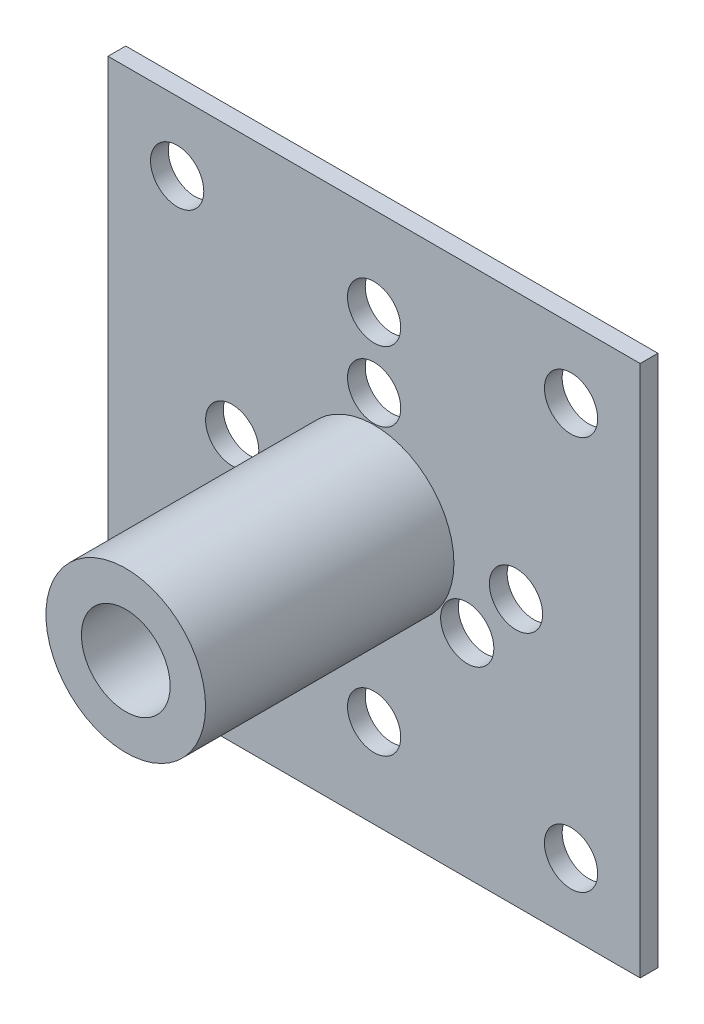
ISO-10303-21;
HEADER;
FILE_DESCRIPTION(('STEP AP214'),'2;1');
FILE_NAME('part.step','',(''),(''),'','','');
FILE_SCHEMA(('AUTOMOTIVE_DESIGN { 1 0 10303 214 1 1 1 1 }'));
ENDSEC;
DATA;
#1=APPLICATION_CONTEXT('core data for automotive mechanical design processes');
#2=APPLICATION_PROTOCOL_DEFINITION('international standard','automotive_design',2000,#1);
#3=PRODUCT_CONTEXT('',#1,'mechanical');
#4=PRODUCT('Part','Part','',(#3));
#5=PRODUCT_RELATED_PRODUCT_CATEGORY('part','',(#4));
#6=PRODUCT_DEFINITION_FORMATION('','',#4);
#7=PRODUCT_DEFINITION_CONTEXT('part definition',#1,'design');
#8=PRODUCT_DEFINITION('design','',#6,#7);
#9=PRODUCT_DEFINITION_SHAPE('','',#8);
#10=(LENGTH_UNIT() NAMED_UNIT(*) SI_UNIT(.MILLI.,.METRE.));
#11=(NAMED_UNIT(*) PLANE_ANGLE_UNIT() SI_UNIT($,.RADIAN.));
#12=(NAMED_UNIT(*) SI_UNIT($,.STERADIAN.) SOLID_ANGLE_UNIT());
#13=UNCERTAINTY_MEASURE_WITH_UNIT(LENGTH_MEASURE(1.E-05),#10,'distance_accuracy_value','');
#14=(GEOMETRIC_REPRESENTATION_CONTEXT(3) GLOBAL_UNCERTAINTY_ASSIGNED_CONTEXT((#13)) GLOBAL_UNIT_ASSIGNED_CONTEXT((#10,
#11,#12)) REPRESENTATION_CONTEXT('',''));
#15=CARTESIAN_POINT('',(0.,0.,0.));
#16=DIRECTION('',(0.,0.,1.));
#17=DIRECTION('',(1.,0.,0.));
#18=AXIS2_PLACEMENT_3D('',#15,#16,#17);
#19=CARTESIAN_POINT('',(0.,0.,15.));
#20=DIRECTION('',(0.,0.,1.));
#21=DIRECTION('',(1.,0.,0.));
#22=AXIS2_PLACEMENT_3D('',#19,#20,#21);
#23=PLANE('',#22);
#24=CARTESIAN_POINT('',(0.,0.,15.));
#25=DIRECTION('',(0.,0.,1.));
#26=DIRECTION('',(1.,0.,0.));
#27=AXIS2_PLACEMENT_3D('',#24,#25,#26);
#28=CIRCLE('',#27,4.5);
#29=CARTESIAN_POINT('',(4.5,0.,15.));
#30=VERTEX_POINT('',#29);
#31=EDGE_CURVE('E11',#30,#30,#28,.T.);
#32=ORIENTED_EDGE('',*,*,#31,.T.);
#33=EDGE_LOOP('',(#32));
#34=FACE_BOUND('',#33,.T.);
#35=CARTESIAN_POINT('',(0.,0.,15.));
#36=DIRECTION('',(0.,0.,1.));
#37=DIRECTION('',(1.,0.,0.));
#38=AXIS2_PLACEMENT_3D('',#35,#36,#37);
#39=CIRCLE('',#38,2.5);
#40=CARTESIAN_POINT('',(2.5,0.,15.));
#41=VERTEX_POINT('',#40);
#42=EDGE_CURVE('E49',#41,#41,#39,.T.);
#43=ORIENTED_EDGE('',*,*,#42,.F.);
#44=EDGE_LOOP('',(#43));
#45=FACE_BOUND('',#44,.T.);
#46=ADVANCED_FACE('F39',(#34,#45),#23,.T.);
#47=CARTESIAN_POINT('',(0.,0.,15.));
#48=DIRECTION('',(0.,0.,-1.));
#49=DIRECTION('',(-1.,0.,0.));
#50=AXIS2_PLACEMENT_3D('',#47,#48,#49);
#51=CYLINDRICAL_SURFACE('',#50,4.5);
#52=CARTESIAN_POINT('',(0.,0.,1.));
#53=DIRECTION('',(0.,0.,1.));
#54=DIRECTION('',(1.,0.,0.));
#55=AXIS2_PLACEMENT_3D('',#52,#53,#54);
#56=CIRCLE('',#55,4.5);
#57=CARTESIAN_POINT('',(4.5,0.,1.));
#58=VERTEX_POINT('',#57);
#59=EDGE_CURVE('E129',#58,#58,#56,.T.);
#60=ORIENTED_EDGE('',*,*,#59,.T.);
#61=EDGE_LOOP('',(#60));
#62=FACE_BOUND('',#61,.T.);
#63=ORIENTED_EDGE('',*,*,#31,.F.);
#64=EDGE_LOOP('',(#63));
#65=FACE_BOUND('',#64,.T.);
#66=ADVANCED_FACE('F41',(#62,#65),#51,.T.);
#67=CARTESIAN_POINT('',(0.,0.,15.));
#68=DIRECTION('',(0.,0.,-1.));
#69=DIRECTION('',(-1.,0.,0.));
#70=AXIS2_PLACEMENT_3D('',#67,#68,#69);
#71=CYLINDRICAL_SURFACE('',#70,2.5);
#72=ORIENTED_EDGE('',*,*,#42,.T.);
#73=EDGE_LOOP('',(#72));
#74=FACE_BOUND('',#73,.T.);
#75=CARTESIAN_POINT('',(0.,0.,0.));
#76=DIRECTION('',(0.,0.,1.));
#77=DIRECTION('',(1.,0.,0.));
#78=AXIS2_PLACEMENT_3D('',#75,#76,#77);
#79=CIRCLE('',#78,2.5);
#80=CARTESIAN_POINT('',(2.5,0.,0.));
#81=VERTEX_POINT('',#80);
#82=EDGE_CURVE('E197',#81,#81,#79,.T.);
#83=ORIENTED_EDGE('',*,*,#82,.F.);
#84=EDGE_LOOP('',(#83));
#85=FACE_BOUND('',#84,.T.);
#86=ADVANCED_FACE('F136',(#74,#85),#71,.F.);
#87=CARTESIAN_POINT('',(-15.,-15.,1.));
#88=DIRECTION('',(1.,0.,0.));
#89=DIRECTION('',(0.,0.,-1.));
#90=AXIS2_PLACEMENT_3D('',#87,#88,#89);
#91=PLANE('',#90);
#92=DIRECTION('',(0.,-1.,0.));
#93=VECTOR('',#92,1.);
#94=CARTESIAN_POINT('',(-15.,-15.,0.));
#95=LINE('',#94,#93);
#96=CARTESIAN_POINT('',(-15.,15.,0.));
#97=VERTEX_POINT('',#96);
#98=CARTESIAN_POINT('',(-15.,-15.,0.));
#99=VERTEX_POINT('',#98);
#100=EDGE_CURVE('E112',#97,#99,#95,.T.);
#101=ORIENTED_EDGE('',*,*,#100,.T.);
#102=DIRECTION('',(0.,0.,-1.));
#103=VECTOR('',#102,1.);
#104=CARTESIAN_POINT('',(-15.,-15.,1.));
#105=LINE('',#104,#103);
#106=CARTESIAN_POINT('',(-15.,-15.,1.));
#107=VERTEX_POINT('',#106);
#108=EDGE_CURVE('E101',#107,#99,#105,.T.);
#109=ORIENTED_EDGE('',*,*,#108,.F.);
#110=DIRECTION('',(0.,-1.,0.));
#111=VECTOR('',#110,1.);
#112=CARTESIAN_POINT('',(-15.,-15.,1.));
#113=LINE('',#112,#111);
#114=CARTESIAN_POINT('',(-15.,15.,1.));
#115=VERTEX_POINT('',#114);
#116=EDGE_CURVE('E93',#115,#107,#113,.T.);
#117=ORIENTED_EDGE('',*,*,#116,.F.);
#118=DIRECTION('',(0.,0.,-1.));
#119=VECTOR('',#118,1.);
#120=CARTESIAN_POINT('',(-15.,15.,1.));
#121=LINE('',#120,#119);
#122=EDGE_CURVE('E108',#115,#97,#121,.T.);
#123=ORIENTED_EDGE('',*,*,#122,.T.);
#124=EDGE_LOOP('',(#101,#109,#117,#123));
#125=FACE_BOUND('',#124,.T.);
#126=ADVANCED_FACE('F212',(#125),#91,.F.);
#127=CARTESIAN_POINT('',(15.,-15.,1.));
#128=DIRECTION('',(0.,1.,0.));
#129=DIRECTION('',(-1.,0.,0.));
#130=AXIS2_PLACEMENT_3D('',#127,#128,#129);
#131=PLANE('',#130);
#132=DIRECTION('',(1.,0.,0.));
#133=VECTOR('',#132,1.);
#134=CARTESIAN_POINT('',(15.,-15.,0.));
#135=LINE('',#134,#133);
#136=CARTESIAN_POINT('',(15.,-15.,0.));
#137=VERTEX_POINT('',#136);
#138=EDGE_CURVE('E99',#99,#137,#135,.T.);
#139=ORIENTED_EDGE('',*,*,#138,.T.);
#140=DIRECTION('',(0.,0.,-1.));
#141=VECTOR('',#140,1.);
#142=CARTESIAN_POINT('',(15.,-15.,1.));
#143=LINE('',#142,#141);
#144=CARTESIAN_POINT('',(15.,-15.,1.));
#145=VERTEX_POINT('',#144);
#146=EDGE_CURVE('E97',#145,#137,#143,.T.);
#147=ORIENTED_EDGE('',*,*,#146,.F.);
#148=DIRECTION('',(1.,0.,0.));
#149=VECTOR('',#148,1.);
#150=CARTESIAN_POINT('',(15.,-15.,1.));
#151=LINE('',#150,#149);
#152=EDGE_CURVE('E88',#107,#145,#151,.T.);
#153=ORIENTED_EDGE('',*,*,#152,.F.);
#154=ORIENTED_EDGE('',*,*,#108,.T.);
#155=EDGE_LOOP('',(#139,#147,#153,#154));
#156=FACE_BOUND('',#155,.T.);
#157=ADVANCED_FACE('F98',(#156),#131,.F.);
#158=CARTESIAN_POINT('',(15.,-15.,1.));
#159=DIRECTION('',(-1.,0.,0.));
#160=DIRECTION('',(0.,0.,1.));
#161=AXIS2_PLACEMENT_3D('',#158,#159,#160);
#162=PLANE('',#161);
#163=DIRECTION('',(0.,1.,0.));
#164=VECTOR('',#163,1.);
#165=CARTESIAN_POINT('',(15.,-15.,0.));
#166=LINE('',#165,#164);
#167=CARTESIAN_POINT('',(15.,15.,0.));
#168=VERTEX_POINT('',#167);
#169=EDGE_CURVE('E74',#137,#168,#166,.T.);
#170=ORIENTED_EDGE('',*,*,#169,.T.);
#171=DIRECTION('',(0.,0.,-1.));
#172=VECTOR('',#171,1.);
#173=CARTESIAN_POINT('',(15.,15.,1.));
#174=LINE('',#173,#172);
#175=CARTESIAN_POINT('',(15.,15.,1.));
#176=VERTEX_POINT('',#175);
#177=EDGE_CURVE('E102',#176,#168,#174,.T.);
#178=ORIENTED_EDGE('',*,*,#177,.F.);
#179=DIRECTION('',(0.,1.,0.));
#180=VECTOR('',#179,1.);
#181=CARTESIAN_POINT('',(15.,-15.,1.));
#182=LINE('',#181,#180);
#183=EDGE_CURVE('E91',#145,#176,#182,.T.);
#184=ORIENTED_EDGE('',*,*,#183,.F.);
#185=ORIENTED_EDGE('',*,*,#146,.T.);
#186=EDGE_LOOP('',(#170,#178,#184,#185));
#187=FACE_BOUND('',#186,.T.);
#188=ADVANCED_FACE('F104',(#187),#162,.F.);
#189=CARTESIAN_POINT('',(15.,15.,1.));
#190=DIRECTION('',(0.,-1.,0.));
#191=DIRECTION('',(1.,0.,0.));
#192=AXIS2_PLACEMENT_3D('',#189,#190,#191);
#193=PLANE('',#192);
#194=DIRECTION('',(-1.,0.,0.));
#195=VECTOR('',#194,1.);
#196=CARTESIAN_POINT('',(15.,15.,0.));
#197=LINE('',#196,#195);
#198=EDGE_CURVE('E80',#168,#97,#197,.T.);
#199=ORIENTED_EDGE('',*,*,#198,.T.);
#200=ORIENTED_EDGE('',*,*,#122,.F.);
#201=DIRECTION('',(-1.,0.,0.));
#202=VECTOR('',#201,1.);
#203=CARTESIAN_POINT('',(15.,15.,1.));
#204=LINE('',#203,#202);
#205=EDGE_CURVE('E57',#176,#115,#204,.T.);
#206=ORIENTED_EDGE('',*,*,#205,.F.);
#207=ORIENTED_EDGE('',*,*,#177,.T.);
#208=EDGE_LOOP('',(#199,#200,#206,#207));
#209=FACE_BOUND('',#208,.T.);
#210=ADVANCED_FACE('F159',(#209),#193,.F.);
#211=CARTESIAN_POINT('',(0.,0.,1.));
#212=DIRECTION('',(0.,0.,1.));
#213=DIRECTION('',(1.,0.,0.));
#214=AXIS2_PLACEMENT_3D('',#211,#212,#213);
#215=PLANE('',#214);
#216=CARTESIAN_POINT('',(5.25,-3.03108891324554,1.));
#217=DIRECTION('',(0.,0.,1.));
#218=DIRECTION('',(1.,0.,0.));
#219=AXIS2_PLACEMENT_3D('',#216,#217,#218);
#220=CIRCLE('',#219,1.5);
#221=CARTESIAN_POINT('',(6.75,-3.03108891324554,1.));
#222=VERTEX_POINT('',#221);
#223=EDGE_CURVE('E116',#222,#222,#220,.F.);
#224=ORIENTED_EDGE('',*,*,#223,.T.);
#225=EDGE_LOOP('',(#224));
#226=FACE_BOUND('',#225,.T.);
#227=CARTESIAN_POINT('',(8.,0.,1.));
#228=DIRECTION('',(0.,0.,1.));
#229=DIRECTION('',(1.,0.,0.));
#230=AXIS2_PLACEMENT_3D('',#227,#228,#229);
#231=CIRCLE('',#230,1.5);
#232=CARTESIAN_POINT('',(9.5,0.,1.));
#233=VERTEX_POINT('',#232);
#234=EDGE_CURVE('E436',#233,#233,#231,.F.);
#235=ORIENTED_EDGE('',*,*,#234,.T.);
#236=EDGE_LOOP('',(#235));
#237=FACE_BOUND('',#236,.T.);
#238=CARTESIAN_POINT('',(0.,10.,1.));
#239=DIRECTION('',(0.,0.,1.));
#240=DIRECTION('',(1.,0.,0.));
#241=AXIS2_PLACEMENT_3D('',#238,#239,#240);
#242=CIRCLE('',#241,1.5);
#243=CARTESIAN_POINT('',(1.5,10.,1.));
#244=VERTEX_POINT('',#243);
#245=EDGE_CURVE('E432',#244,#244,#242,.F.);
#246=ORIENTED_EDGE('',*,*,#245,.T.);
#247=EDGE_LOOP('',(#246));
#248=FACE_BOUND('',#247,.T.);
#249=CARTESIAN_POINT('',(0.,-10.,1.));
#250=DIRECTION('',(0.,0.,1.));
#251=DIRECTION('',(1.,0.,0.));
#252=AXIS2_PLACEMENT_3D('',#249,#250,#251);
#253=CIRCLE('',#252,1.5);
#254=CARTESIAN_POINT('',(1.5,-10.,1.));
#255=VERTEX_POINT('',#254);
#256=EDGE_CURVE('E428',#255,#255,#253,.F.);
#257=ORIENTED_EDGE('',*,*,#256,.T.);
#258=EDGE_LOOP('',(#257));
#259=FACE_BOUND('',#258,.T.);
#260=CARTESIAN_POINT('',(-11.1015764646288,11.1015764646288,1.));
#261=DIRECTION('',(0.,0.,1.));
#262=DIRECTION('',(1.,0.,0.));
#263=AXIS2_PLACEMENT_3D('',#260,#261,#262);
#264=CIRCLE('',#263,1.5);
#265=CARTESIAN_POINT('',(-9.60157646462882,11.1015764646288,1.));
#266=VERTEX_POINT('',#265);
#267=EDGE_CURVE('E424',#266,#266,#264,.F.);
#268=ORIENTED_EDGE('',*,*,#267,.T.);
#269=EDGE_LOOP('',(#268));
#270=FACE_BOUND('',#269,.T.);
#271=CARTESIAN_POINT('',(11.1015764646288,11.1015764646288,1.));
#272=DIRECTION('',(0.,0.,1.));
#273=DIRECTION('',(1.,0.,0.));
#274=AXIS2_PLACEMENT_3D('',#271,#272,#273);
#275=CIRCLE('',#274,1.5);
#276=CARTESIAN_POINT('',(12.6015764646288,11.1015764646288,1.));
#277=VERTEX_POINT('',#276);
#278=EDGE_CURVE('E420',#277,#277,#275,.F.);
#279=ORIENTED_EDGE('',*,*,#278,.T.);
#280=EDGE_LOOP('',(#279));
#281=FACE_BOUND('',#280,.T.);
#282=CARTESIAN_POINT('',(11.1015764646288,-11.1015764646288,1.));
#283=DIRECTION('',(0.,0.,1.));
#284=DIRECTION('',(1.,0.,0.));
#285=AXIS2_PLACEMENT_3D('',#282,#283,#284);
#286=CIRCLE('',#285,1.5);
#287=CARTESIAN_POINT('',(12.6015764646288,-11.1015764646288,1.));
#288=VERTEX_POINT('',#287);
#289=EDGE_CURVE('E416',#288,#288,#286,.F.);
#290=ORIENTED_EDGE('',*,*,#289,.T.);
#291=EDGE_LOOP('',(#290));
#292=FACE_BOUND('',#291,.T.);
#293=CARTESIAN_POINT('',(-11.1015764646288,-11.1015764646288,1.));
#294=DIRECTION('',(0.,0.,1.));
#295=DIRECTION('',(1.,0.,0.));
#296=AXIS2_PLACEMENT_3D('',#293,#294,#295);
#297=CIRCLE('',#296,1.5);
#298=CARTESIAN_POINT('',(-9.60157646462882,-11.1015764646288,1.));
#299=VERTEX_POINT('',#298);
#300=EDGE_CURVE('E412',#299,#299,#297,.F.);
#301=ORIENTED_EDGE('',*,*,#300,.T.);
#302=EDGE_LOOP('',(#301));
#303=FACE_BOUND('',#302,.T.);
#304=CARTESIAN_POINT('',(-5.25,-3.03108891324554,1.));
#305=DIRECTION('',(0.,0.,1.));
#306=DIRECTION('',(1.,0.,0.));
#307=AXIS2_PLACEMENT_3D('',#304,#305,#306);
#308=CIRCLE('',#307,1.5);
#309=CARTESIAN_POINT('',(-3.75,-3.03108891324554,1.));
#310=VERTEX_POINT('',#309);
#311=EDGE_CURVE('E408',#310,#310,#308,.F.);
#312=ORIENTED_EDGE('',*,*,#311,.T.);
#313=EDGE_LOOP('',(#312));
#314=FACE_BOUND('',#313,.T.);
#315=CARTESIAN_POINT('',(0.,6.06217782649107,1.));
#316=DIRECTION('',(0.,0.,1.));
#317=DIRECTION('',(1.,0.,0.));
#318=AXIS2_PLACEMENT_3D('',#315,#316,#317);
#319=CIRCLE('',#318,1.5);
#320=CARTESIAN_POINT('',(1.5,6.06217782649107,1.));
#321=VERTEX_POINT('',#320);
#322=EDGE_CURVE('E404',#321,#321,#319,.F.);
#323=ORIENTED_EDGE('',*,*,#322,.T.);
#324=EDGE_LOOP('',(#323));
#325=FACE_BOUND('',#324,.T.);
#326=CARTESIAN_POINT('',(-8.,0.,1.));
#327=DIRECTION('',(0.,0.,1.));
#328=DIRECTION('',(1.,0.,0.));
#329=AXIS2_PLACEMENT_3D('',#326,#327,#328);
#330=CIRCLE('',#329,1.5);
#331=CARTESIAN_POINT('',(-6.5,0.,1.));
#332=VERTEX_POINT('',#331);
#333=EDGE_CURVE('E400',#332,#332,#330,.F.);
#334=ORIENTED_EDGE('',*,*,#333,.T.);
#335=EDGE_LOOP('',(#334));
#336=FACE_BOUND('',#335,.T.);
#337=ORIENTED_EDGE('',*,*,#59,.F.);
#338=EDGE_LOOP('',(#337));
#339=FACE_BOUND('',#338,.T.);
#340=ORIENTED_EDGE('',*,*,#116,.T.);
#341=ORIENTED_EDGE('',*,*,#152,.T.);
#342=ORIENTED_EDGE('',*,*,#183,.T.);
#343=ORIENTED_EDGE('',*,*,#205,.T.);
#344=EDGE_LOOP('',(#340,#341,#342,#343));
#345=FACE_BOUND('',#344,.T.);
#346=ADVANCED_FACE('F89',(#226,#237,#248,#259,#270,#281,#292,#303,#314,#325,#336,#339,#345),
#215,.T.);
#347=CARTESIAN_POINT('',(0.,0.,0.));
#348=DIRECTION('',(0.,0.,1.));
#349=DIRECTION('',(1.,0.,0.));
#350=AXIS2_PLACEMENT_3D('',#347,#348,#349);
#351=PLANE('',#350);
#352=CARTESIAN_POINT('',(5.25,-3.03108891324554,0.));
#353=DIRECTION('',(0.,0.,1.));
#354=DIRECTION('',(1.,0.,0.));
#355=AXIS2_PLACEMENT_3D('',#352,#353,#354);
#356=CIRCLE('',#355,1.5);
#357=CARTESIAN_POINT('',(6.75,-3.03108891324554,0.));
#358=VERTEX_POINT('',#357);
#359=EDGE_CURVE('E165',#358,#358,#356,.T.);
#360=ORIENTED_EDGE('',*,*,#359,.T.);
#361=EDGE_LOOP('',(#360));
#362=FACE_BOUND('',#361,.T.);
#363=CARTESIAN_POINT('',(8.,0.,0.));
#364=DIRECTION('',(0.,0.,1.));
#365=DIRECTION('',(-1.,0.,0.));
#366=AXIS2_PLACEMENT_3D('',#363,#364,#365);
#367=CIRCLE('',#366,1.5);
#368=CARTESIAN_POINT('',(6.5,0.,0.));
#369=VERTEX_POINT('',#368);
#370=EDGE_CURVE('E169',#369,#369,#367,.T.);
#371=ORIENTED_EDGE('',*,*,#370,.T.);
#372=EDGE_LOOP('',(#371));
#373=FACE_BOUND('',#372,.T.);
#374=CARTESIAN_POINT('',(0.,10.,0.));
#375=DIRECTION('',(0.,0.,1.));
#376=DIRECTION('',(-1.,0.,0.));
#377=AXIS2_PLACEMENT_3D('',#374,#375,#376);
#378=CIRCLE('',#377,1.5);
#379=CARTESIAN_POINT('',(-1.5,10.,0.));
#380=VERTEX_POINT('',#379);
#381=EDGE_CURVE('E173',#380,#380,#378,.T.);
#382=ORIENTED_EDGE('',*,*,#381,.T.);
#383=EDGE_LOOP('',(#382));
#384=FACE_BOUND('',#383,.T.);
#385=CARTESIAN_POINT('',(0.,-10.,0.));
#386=DIRECTION('',(0.,0.,1.));
#387=DIRECTION('',(1.,0.,0.));
#388=AXIS2_PLACEMENT_3D('',#385,#386,#387);
#389=CIRCLE('',#388,1.5);
#390=CARTESIAN_POINT('',(1.5,-10.,0.));
#391=VERTEX_POINT('',#390);
#392=EDGE_CURVE('E177',#391,#391,#389,.T.);
#393=ORIENTED_EDGE('',*,*,#392,.T.);
#394=EDGE_LOOP('',(#393));
#395=FACE_BOUND('',#394,.T.);
#396=CARTESIAN_POINT('',(-11.1015764646288,11.1015764646288,0.));
#397=DIRECTION('',(0.,0.,1.));
#398=DIRECTION('',(-1.,0.,0.));
#399=AXIS2_PLACEMENT_3D('',#396,#397,#398);
#400=CIRCLE('',#399,1.5);
#401=CARTESIAN_POINT('',(-12.6015764646288,11.1015764646288,0.));
#402=VERTEX_POINT('',#401);
#403=EDGE_CURVE('E181',#402,#402,#400,.T.);
#404=ORIENTED_EDGE('',*,*,#403,.T.);
#405=EDGE_LOOP('',(#404));
#406=FACE_BOUND('',#405,.T.);
#407=CARTESIAN_POINT('',(11.1015764646288,11.1015764646288,0.));
#408=DIRECTION('',(0.,0.,1.));
#409=DIRECTION('',(1.,0.,0.));
#410=AXIS2_PLACEMENT_3D('',#407,#408,#409);
#411=CIRCLE('',#410,1.5);
#412=CARTESIAN_POINT('',(12.6015764646288,11.1015764646288,0.));
#413=VERTEX_POINT('',#412);
#414=EDGE_CURVE('E185',#413,#413,#411,.T.);
#415=ORIENTED_EDGE('',*,*,#414,.T.);
#416=EDGE_LOOP('',(#415));
#417=FACE_BOUND('',#416,.T.);
#418=CARTESIAN_POINT('',(11.1015764646288,-11.1015764646288,0.));
#419=DIRECTION('',(0.,0.,1.));
#420=DIRECTION('',(-1.,0.,0.));
#421=AXIS2_PLACEMENT_3D('',#418,#419,#420);
#422=CIRCLE('',#421,1.5);
#423=CARTESIAN_POINT('',(9.60157646462882,-11.1015764646288,0.));
#424=VERTEX_POINT('',#423);
#425=EDGE_CURVE('E189',#424,#424,#422,.T.);
#426=ORIENTED_EDGE('',*,*,#425,.T.);
#427=EDGE_LOOP('',(#426));
#428=FACE_BOUND('',#427,.T.);
#429=CARTESIAN_POINT('',(-11.1015764646288,-11.1015764646288,0.));
#430=DIRECTION('',(0.,0.,1.));
#431=DIRECTION('',(1.,0.,0.));
#432=AXIS2_PLACEMENT_3D('',#429,#430,#431);
#433=CIRCLE('',#432,1.5);
#434=CARTESIAN_POINT('',(-9.60157646462882,-11.1015764646288,0.));
#435=VERTEX_POINT('',#434);
#436=EDGE_CURVE('E193',#435,#435,#433,.T.);
#437=ORIENTED_EDGE('',*,*,#436,.T.);
#438=EDGE_LOOP('',(#437));
#439=FACE_BOUND('',#438,.T.);
#440=ORIENTED_EDGE('',*,*,#82,.T.);
#441=EDGE_LOOP('',(#440));
#442=FACE_BOUND('',#441,.T.);
#443=CARTESIAN_POINT('',(-5.25,-3.03108891324554,0.));
#444=DIRECTION('',(0.,0.,1.));
#445=DIRECTION('',(1.,0.,0.));
#446=AXIS2_PLACEMENT_3D('',#443,#444,#445);
#447=CIRCLE('',#446,1.5);
#448=CARTESIAN_POINT('',(-3.75,-3.03108891324554,0.));
#449=VERTEX_POINT('',#448);
#450=EDGE_CURVE('E201',#449,#449,#447,.T.);
#451=ORIENTED_EDGE('',*,*,#450,.T.);
#452=EDGE_LOOP('',(#451));
#453=FACE_BOUND('',#452,.T.);
#454=CARTESIAN_POINT('',(0.,6.06217782649107,0.));
#455=DIRECTION('',(0.,0.,1.));
#456=DIRECTION('',(1.,0.,0.));
#457=AXIS2_PLACEMENT_3D('',#454,#455,#456);
#458=CIRCLE('',#457,1.5);
#459=CARTESIAN_POINT('',(1.5,6.06217782649107,0.));
#460=VERTEX_POINT('',#459);
#461=EDGE_CURVE('E205',#460,#460,#458,.T.);
#462=ORIENTED_EDGE('',*,*,#461,.T.);
#463=EDGE_LOOP('',(#462));
#464=FACE_BOUND('',#463,.T.);
#465=CARTESIAN_POINT('',(-8.,0.,0.));
#466=DIRECTION('',(0.,0.,1.));
#467=DIRECTION('',(1.,0.,0.));
#468=AXIS2_PLACEMENT_3D('',#465,#466,#467);
#469=CIRCLE('',#468,1.5);
#470=CARTESIAN_POINT('',(-6.5,0.,0.));
#471=VERTEX_POINT('',#470);
#472=EDGE_CURVE('E209',#471,#471,#469,.T.);
#473=ORIENTED_EDGE('',*,*,#472,.T.);
#474=EDGE_LOOP('',(#473));
#475=FACE_BOUND('',#474,.T.);
#476=ORIENTED_EDGE('',*,*,#100,.F.);
#477=ORIENTED_EDGE('',*,*,#198,.F.);
#478=ORIENTED_EDGE('',*,*,#169,.F.);
#479=ORIENTED_EDGE('',*,*,#138,.F.);
#480=EDGE_LOOP('',(#476,#477,#478,#479));
#481=FACE_BOUND('',#480,.T.);
#482=ADVANCED_FACE('F148',(#362,#373,#384,#395,#406,#417,#428,#439,#442,#453,#464,#475,#481),
#351,.F.);
#483=CARTESIAN_POINT('',(-8.,0.,20.));
#484=DIRECTION('',(0.,0.,-1.));
#485=DIRECTION('',(-1.,0.,0.));
#486=AXIS2_PLACEMENT_3D('',#483,#484,#485);
#487=CYLINDRICAL_SURFACE('',#486,1.5);
#488=ORIENTED_EDGE('',*,*,#333,.F.);
#489=EDGE_LOOP('',(#488));
#490=FACE_BOUND('',#489,.T.);
#491=ORIENTED_EDGE('',*,*,#472,.F.);
#492=EDGE_LOOP('',(#491));
#493=FACE_BOUND('',#492,.T.);
#494=ADVANCED_FACE('F150',(#490,#493),#487,.F.);
#495=CARTESIAN_POINT('',(0.,6.06217782649107,20.));
#496=DIRECTION('',(0.,0.,-1.));
#497=DIRECTION('',(-1.,0.,0.));
#498=AXIS2_PLACEMENT_3D('',#495,#496,#497);
#499=CYLINDRICAL_SURFACE('',#498,1.5);
#500=ORIENTED_EDGE('',*,*,#322,.F.);
#501=EDGE_LOOP('',(#500));
#502=FACE_BOUND('',#501,.T.);
#503=ORIENTED_EDGE('',*,*,#461,.F.);
#504=EDGE_LOOP('',(#503));
#505=FACE_BOUND('',#504,.T.);
#506=ADVANCED_FACE('F156',(#502,#505),#499,.F.);
#507=CARTESIAN_POINT('',(-5.25,-3.03108891324554,20.));
#508=DIRECTION('',(0.,0.,-1.));
#509=DIRECTION('',(-1.,0.,0.));
#510=AXIS2_PLACEMENT_3D('',#507,#508,#509);
#511=CYLINDRICAL_SURFACE('',#510,1.5);
#512=ORIENTED_EDGE('',*,*,#311,.F.);
#513=EDGE_LOOP('',(#512));
#514=FACE_BOUND('',#513,.T.);
#515=ORIENTED_EDGE('',*,*,#450,.F.);
#516=EDGE_LOOP('',(#515));
#517=FACE_BOUND('',#516,.T.);
#518=ADVANCED_FACE('F285',(#514,#517),#511,.F.);
#519=CARTESIAN_POINT('',(-11.1015764646288,-11.1015764646288,20.));
#520=DIRECTION('',(0.,0.,-1.));
#521=DIRECTION('',(-1.,0.,0.));
#522=AXIS2_PLACEMENT_3D('',#519,#520,#521);
#523=CYLINDRICAL_SURFACE('',#522,1.5);
#524=ORIENTED_EDGE('',*,*,#300,.F.);
#525=EDGE_LOOP('',(#524));
#526=FACE_BOUND('',#525,.T.);
#527=ORIENTED_EDGE('',*,*,#436,.F.);
#528=EDGE_LOOP('',(#527));
#529=FACE_BOUND('',#528,.T.);
#530=ADVANCED_FACE('F294',(#526,#529),#523,.F.);
#531=CARTESIAN_POINT('',(11.1015764646288,-11.1015764646288,20.));
#532=DIRECTION('',(0.,0.,-1.));
#533=DIRECTION('',(-1.,0.,0.));
#534=AXIS2_PLACEMENT_3D('',#531,#532,#533);
#535=CYLINDRICAL_SURFACE('',#534,1.5);
#536=ORIENTED_EDGE('',*,*,#289,.F.);
#537=EDGE_LOOP('',(#536));
#538=FACE_BOUND('',#537,.T.);
#539=ORIENTED_EDGE('',*,*,#425,.F.);
#540=EDGE_LOOP('',(#539));
#541=FACE_BOUND('',#540,.T.);
#542=ADVANCED_FACE('F303',(#538,#541),#535,.F.);
#543=CARTESIAN_POINT('',(11.1015764646288,11.1015764646288,20.));
#544=DIRECTION('',(0.,0.,-1.));
#545=DIRECTION('',(-1.,0.,0.));
#546=AXIS2_PLACEMENT_3D('',#543,#544,#545);
#547=CYLINDRICAL_SURFACE('',#546,1.5);
#548=ORIENTED_EDGE('',*,*,#278,.F.);
#549=EDGE_LOOP('',(#548));
#550=FACE_BOUND('',#549,.T.);
#551=ORIENTED_EDGE('',*,*,#414,.F.);
#552=EDGE_LOOP('',(#551));
#553=FACE_BOUND('',#552,.T.);
#554=ADVANCED_FACE('F312',(#550,#553),#547,.F.);
#555=CARTESIAN_POINT('',(-11.1015764646288,11.1015764646288,20.));
#556=DIRECTION('',(0.,0.,-1.));
#557=DIRECTION('',(-1.,0.,0.));
#558=AXIS2_PLACEMENT_3D('',#555,#556,#557);
#559=CYLINDRICAL_SURFACE('',#558,1.5);
#560=ORIENTED_EDGE('',*,*,#267,.F.);
#561=EDGE_LOOP('',(#560));
#562=FACE_BOUND('',#561,.T.);
#563=ORIENTED_EDGE('',*,*,#403,.F.);
#564=EDGE_LOOP('',(#563));
#565=FACE_BOUND('',#564,.T.);
#566=ADVANCED_FACE('F321',(#562,#565),#559,.F.);
#567=CARTESIAN_POINT('',(0.,-10.,20.));
#568=DIRECTION('',(0.,0.,-1.));
#569=DIRECTION('',(-1.,0.,0.));
#570=AXIS2_PLACEMENT_3D('',#567,#568,#569);
#571=CYLINDRICAL_SURFACE('',#570,1.5);
#572=ORIENTED_EDGE('',*,*,#256,.F.);
#573=EDGE_LOOP('',(#572));
#574=FACE_BOUND('',#573,.T.);
#575=ORIENTED_EDGE('',*,*,#392,.F.);
#576=EDGE_LOOP('',(#575));
#577=FACE_BOUND('',#576,.T.);
#578=ADVANCED_FACE('F330',(#574,#577),#571,.F.);
#579=CARTESIAN_POINT('',(0.,10.,20.));
#580=DIRECTION('',(0.,0.,-1.));
#581=DIRECTION('',(-1.,0.,0.));
#582=AXIS2_PLACEMENT_3D('',#579,#580,#581);
#583=CYLINDRICAL_SURFACE('',#582,1.5);
#584=ORIENTED_EDGE('',*,*,#245,.F.);
#585=EDGE_LOOP('',(#584));
#586=FACE_BOUND('',#585,.T.);
#587=ORIENTED_EDGE('',*,*,#381,.F.);
#588=EDGE_LOOP('',(#587));
#589=FACE_BOUND('',#588,.T.);
#590=ADVANCED_FACE('F339',(#586,#589),#583,.F.);
#591=CARTESIAN_POINT('',(8.,0.,20.));
#592=DIRECTION('',(0.,0.,-1.));
#593=DIRECTION('',(-1.,0.,0.));
#594=AXIS2_PLACEMENT_3D('',#591,#592,#593);
#595=CYLINDRICAL_SURFACE('',#594,1.5);
#596=ORIENTED_EDGE('',*,*,#234,.F.);
#597=EDGE_LOOP('',(#596));
#598=FACE_BOUND('',#597,.T.);
#599=ORIENTED_EDGE('',*,*,#370,.F.);
#600=EDGE_LOOP('',(#599));
#601=FACE_BOUND('',#600,.T.);
#602=ADVANCED_FACE('F348',(#598,#601),#595,.F.);
#603=CARTESIAN_POINT('',(5.25,-3.03108891324554,20.));
#604=DIRECTION('',(0.,0.,-1.));
#605=DIRECTION('',(-1.,0.,0.));
#606=AXIS2_PLACEMENT_3D('',#603,#604,#605);
#607=CYLINDRICAL_SURFACE('',#606,1.5);
#608=ORIENTED_EDGE('',*,*,#223,.F.);
#609=EDGE_LOOP('',(#608));
#610=FACE_BOUND('',#609,.T.);
#611=ORIENTED_EDGE('',*,*,#359,.F.);
#612=EDGE_LOOP('',(#611));
#613=FACE_BOUND('',#612,.T.);
#614=ADVANCED_FACE('F357',(#610,#613),#607,.F.);
#615=CLOSED_SHELL('',(#46,#66,#86,#126,#157,#188,#210,#346,#482,#494,#506,#518,#530,#542,#554,
#566,#578,#590,#602,#614));
#616=MANIFOLD_SOLID_BREP('B2',#615);
#617=ADVANCED_BREP_SHAPE_REPRESENTATION('',(#18,#616),#14);
#618=SHAPE_DEFINITION_REPRESENTATION(#9,#617);
ENDSEC;
END-ISO-10303-21;
